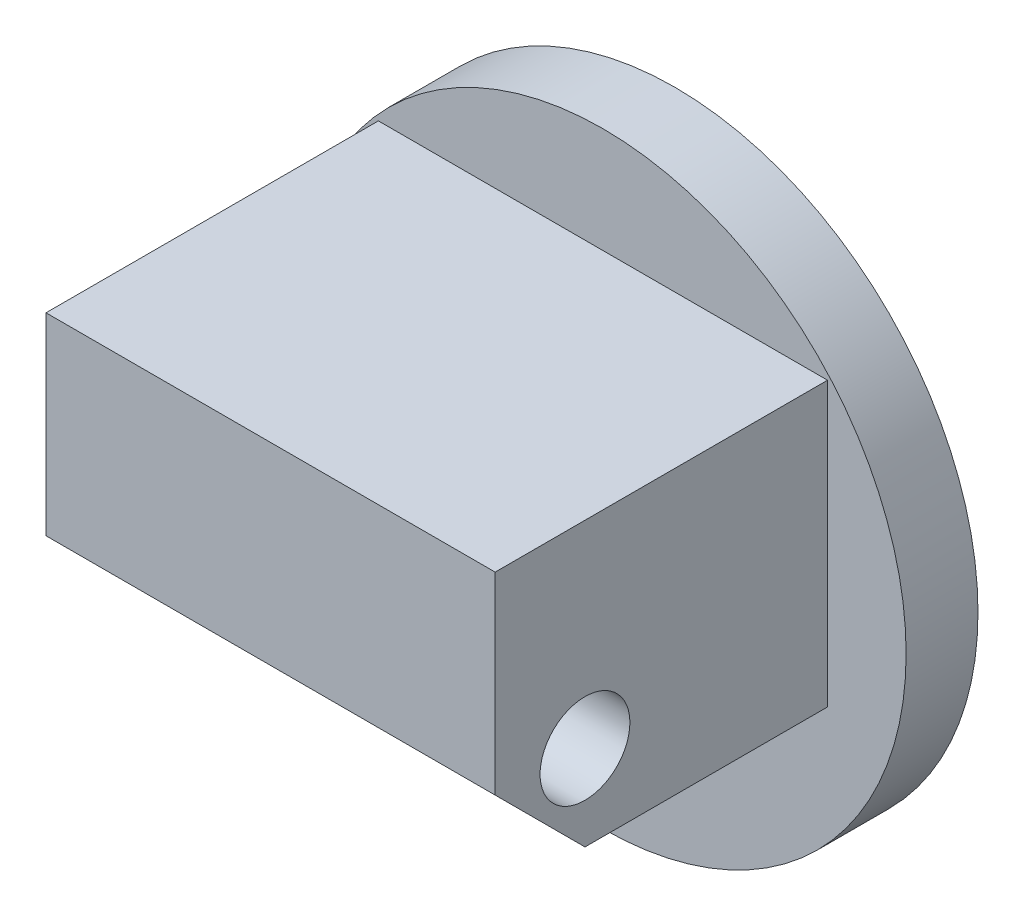
ISO-10303-21;
HEADER;
FILE_DESCRIPTION(('STEP AP214'),'2;1');
FILE_NAME('part.step','',(''),(''),'','','');
FILE_SCHEMA(('AUTOMOTIVE_DESIGN { 1 0 10303 214 1 1 1 1 }'));
ENDSEC;
DATA;
#1=APPLICATION_CONTEXT('core data for automotive mechanical design processes');
#2=APPLICATION_PROTOCOL_DEFINITION('international standard','automotive_design',2000,#1);
#3=PRODUCT_CONTEXT('',#1,'mechanical');
#4=PRODUCT('Part','Part','',(#3));
#5=PRODUCT_RELATED_PRODUCT_CATEGORY('part','',(#4));
#6=PRODUCT_DEFINITION_FORMATION('','',#4);
#7=PRODUCT_DEFINITION_CONTEXT('part definition',#1,'design');
#8=PRODUCT_DEFINITION('design','',#6,#7);
#9=PRODUCT_DEFINITION_SHAPE('','',#8);
#10=(LENGTH_UNIT() NAMED_UNIT(*) SI_UNIT(.MILLI.,.METRE.));
#11=(NAMED_UNIT(*) PLANE_ANGLE_UNIT() SI_UNIT($,.RADIAN.));
#12=(NAMED_UNIT(*) SI_UNIT($,.STERADIAN.) SOLID_ANGLE_UNIT());
#13=UNCERTAINTY_MEASURE_WITH_UNIT(LENGTH_MEASURE(1.E-05),#10,'distance_accuracy_value','');
#14=(GEOMETRIC_REPRESENTATION_CONTEXT(3) GLOBAL_UNCERTAINTY_ASSIGNED_CONTEXT((#13)) GLOBAL_UNIT_ASSIGNED_CONTEXT((#10,
#11,#12)) REPRESENTATION_CONTEXT('',''));
#15=CARTESIAN_POINT('',(0.,0.,0.));
#16=DIRECTION('',(0.,0.,1.));
#17=DIRECTION('',(1.,0.,0.));
#18=AXIS2_PLACEMENT_3D('',#15,#16,#17);
#19=CARTESIAN_POINT('',(0.,0.,9.));
#20=DIRECTION('',(0.,0.,-1.));
#21=DIRECTION('',(-1.,0.,0.));
#22=AXIS2_PLACEMENT_3D('',#19,#20,#21);
#23=CYLINDRICAL_SURFACE('',#22,6.75000000000001);
#24=CARTESIAN_POINT('',(0.,0.,0.));
#25=DIRECTION('',(0.,0.,1.));
#26=DIRECTION('',(1.,0.,0.));
#27=AXIS2_PLACEMENT_3D('',#24,#25,#26);
#28=CIRCLE('',#27,6.75000000000001);
#29=CARTESIAN_POINT('',(6.75000000000001,0.,0.));
#30=VERTEX_POINT('',#29);
#31=EDGE_CURVE('E127',#30,#30,#28,.T.);
#32=ORIENTED_EDGE('',*,*,#31,.T.);
#33=EDGE_LOOP('',(#32));
#34=FACE_BOUND('',#33,.T.);
#35=CARTESIAN_POINT('',(0.,0.,1.6));
#36=DIRECTION('',(0.,0.,-1.));
#37=DIRECTION('',(-1.,0.,0.));
#38=AXIS2_PLACEMENT_3D('',#35,#36,#37);
#39=CIRCLE('',#38,6.75000000000001);
#40=CARTESIAN_POINT('',(-6.75000000000001,0.,1.6));
#41=VERTEX_POINT('',#40);
#42=EDGE_CURVE('E117',#41,#41,#39,.T.);
#43=ORIENTED_EDGE('',*,*,#42,.T.);
#44=EDGE_LOOP('',(#43));
#45=FACE_BOUND('',#44,.T.);
#46=ADVANCED_FACE('F49',(#34,#45),#23,.T.);
#47=CARTESIAN_POINT('',(0.,0.,9.));
#48=DIRECTION('',(0.,0.,1.));
#49=DIRECTION('',(1.,0.,0.));
#50=AXIS2_PLACEMENT_3D('',#47,#48,#49);
#51=PLANE('',#50);
#52=DIRECTION('',(0.,1.,0.));
#53=VECTOR('',#52,1.);
#54=CARTESIAN_POINT('',(-5.,0.,9.));
#55=LINE('',#54,#53);
#56=CARTESIAN_POINT('',(-5.,0.0999999999999987,9.));
#57=VERTEX_POINT('',#56);
#58=CARTESIAN_POINT('',(-5.,4.39999999999999,9.));
#59=VERTEX_POINT('',#58);
#60=EDGE_CURVE('E115',#57,#59,#55,.T.);
#61=ORIENTED_EDGE('',*,*,#60,.F.);
#62=DIRECTION('',(1.,0.,0.));
#63=VECTOR('',#62,1.);
#64=CARTESIAN_POINT('',(0.,0.0999999999999987,9.));
#65=LINE('',#64,#63);
#66=CARTESIAN_POINT('',(5.,0.0999999999999987,9.));
#67=VERTEX_POINT('',#66);
#68=EDGE_CURVE('E145',#57,#67,#65,.T.);
#69=ORIENTED_EDGE('',*,*,#68,.T.);
#70=DIRECTION('',(0.,-1.,0.));
#71=VECTOR('',#70,1.);
#72=CARTESIAN_POINT('',(5.,0.,9.));
#73=LINE('',#72,#71);
#74=CARTESIAN_POINT('',(5.,4.39999999999999,9.));
#75=VERTEX_POINT('',#74);
#76=EDGE_CURVE('E137',#75,#67,#73,.T.);
#77=ORIENTED_EDGE('',*,*,#76,.F.);
#78=DIRECTION('',(1.,0.,0.));
#79=VECTOR('',#78,1.);
#80=CARTESIAN_POINT('',(-6.75000000000001,4.39999999999999,9.));
#81=LINE('',#80,#79);
#82=EDGE_CURVE('E107',#59,#75,#81,.T.);
#83=ORIENTED_EDGE('',*,*,#82,.F.);
#84=EDGE_LOOP('',(#61,#69,#77,#83));
#85=FACE_BOUND('',#84,.T.);
#86=ADVANCED_FACE('F154',(#85),#51,.T.);
#87=CARTESIAN_POINT('',(5.,-6.75000000000001,1.6));
#88=DIRECTION('',(-1.,0.,0.));
#89=DIRECTION('',(0.,0.,1.));
#90=AXIS2_PLACEMENT_3D('',#87,#88,#89);
#91=PLANE('',#90);
#92=CARTESIAN_POINT('',(5.,0.,7.));
#93=DIRECTION('',(1.,0.,0.));
#94=DIRECTION('',(0.,0.,-1.));
#95=AXIS2_PLACEMENT_3D('',#92,#93,#94);
#96=CIRCLE('',#95,1.);
#97=CARTESIAN_POINT('',(5.,0.,6.));
#98=VERTEX_POINT('',#97);
#99=EDGE_CURVE('E148',#98,#98,#96,.T.);
#100=ORIENTED_EDGE('',*,*,#99,.F.);
#101=EDGE_LOOP('',(#100));
#102=FACE_BOUND('',#101,.T.);
#103=ORIENTED_EDGE('',*,*,#76,.T.);
#104=DIRECTION('',(0.,0.707106781186548,0.707106781186547));
#105=VECTOR('',#104,1.);
#106=CARTESIAN_POINT('',(5.,0.099999999999999,9.));
#107=LINE('',#106,#105);
#108=CARTESIAN_POINT('',(5.,-1.90000000000001,6.99999999999999));
#109=VERTEX_POINT('',#108);
#110=EDGE_CURVE('E72',#67,#109,#107,.F.);
#111=ORIENTED_EDGE('',*,*,#110,.T.);
#112=DIRECTION('',(0.,0.,1.));
#113=VECTOR('',#112,1.);
#114=CARTESIAN_POINT('',(5.,-1.90000000000001,1.6));
#115=LINE('',#114,#113);
#116=CARTESIAN_POINT('',(5.,-1.90000000000001,1.6));
#117=VERTEX_POINT('',#116);
#118=EDGE_CURVE('E129',#117,#109,#115,.T.);
#119=ORIENTED_EDGE('',*,*,#118,.F.);
#120=DIRECTION('',(0.,1.,0.));
#121=VECTOR('',#120,1.);
#122=CARTESIAN_POINT('',(5.,-6.75000000000001,1.6));
#123=LINE('',#122,#121);
#124=CARTESIAN_POINT('',(5.,4.39999999999999,1.6));
#125=VERTEX_POINT('',#124);
#126=EDGE_CURVE('E124',#117,#125,#123,.T.);
#127=ORIENTED_EDGE('',*,*,#126,.T.);
#128=DIRECTION('',(0.,0.,1.));
#129=VECTOR('',#128,1.);
#130=CARTESIAN_POINT('',(5.,4.39999999999999,1.6));
#131=LINE('',#130,#129);
#132=EDGE_CURVE('E102',#125,#75,#131,.T.);
#133=ORIENTED_EDGE('',*,*,#132,.T.);
#134=EDGE_LOOP('',(#103,#111,#119,#127,#133));
#135=FACE_BOUND('',#134,.T.);
#136=ADVANCED_FACE('F157',(#102,#135),#91,.F.);
#137=CARTESIAN_POINT('',(-5.,-6.75000000000001,1.6));
#138=DIRECTION('',(1.,0.,0.));
#139=DIRECTION('',(0.,0.,-1.));
#140=AXIS2_PLACEMENT_3D('',#137,#138,#139);
#141=PLANE('',#140);
#142=CARTESIAN_POINT('',(-5.,0.,7.));
#143=DIRECTION('',(1.,0.,0.));
#144=DIRECTION('',(0.,0.,-1.));
#145=AXIS2_PLACEMENT_3D('',#142,#143,#144);
#146=CIRCLE('',#145,1.);
#147=CARTESIAN_POINT('',(-5.,0.,6.));
#148=VERTEX_POINT('',#147);
#149=EDGE_CURVE('E108',#148,#148,#146,.T.);
#150=ORIENTED_EDGE('',*,*,#149,.T.);
#151=EDGE_LOOP('',(#150));
#152=FACE_BOUND('',#151,.T.);
#153=DIRECTION('',(0.,0.,-1.));
#154=VECTOR('',#153,1.);
#155=CARTESIAN_POINT('',(-5.,-1.90000000000001,1.6));
#156=LINE('',#155,#154);
#157=CARTESIAN_POINT('',(-5.,-1.90000000000001,6.99999999999999));
#158=VERTEX_POINT('',#157);
#159=CARTESIAN_POINT('',(-5.,-1.90000000000001,1.6));
#160=VERTEX_POINT('',#159);
#161=EDGE_CURVE('E116',#158,#160,#156,.T.);
#162=ORIENTED_EDGE('',*,*,#161,.F.);
#163=DIRECTION('',(0.,-0.707106781186548,-0.707106781186547));
#164=VECTOR('',#163,1.);
#165=CARTESIAN_POINT('',(-5.,0.099999999999999,9.));
#166=LINE('',#165,#164);
#167=EDGE_CURVE('E11',#158,#57,#166,.F.);
#168=ORIENTED_EDGE('',*,*,#167,.T.);
#169=ORIENTED_EDGE('',*,*,#60,.T.);
#170=DIRECTION('',(0.,0.,-1.));
#171=VECTOR('',#170,1.);
#172=CARTESIAN_POINT('',(-5.,4.39999999999999,1.6));
#173=LINE('',#172,#171);
#174=CARTESIAN_POINT('',(-5.,4.39999999999999,1.6));
#175=VERTEX_POINT('',#174);
#176=EDGE_CURVE('E99',#59,#175,#173,.T.);
#177=ORIENTED_EDGE('',*,*,#176,.T.);
#178=DIRECTION('',(0.,1.,0.));
#179=VECTOR('',#178,1.);
#180=CARTESIAN_POINT('',(-5.,-6.75000000000001,1.6));
#181=LINE('',#180,#179);
#182=EDGE_CURVE('E113',#160,#175,#181,.T.);
#183=ORIENTED_EDGE('',*,*,#182,.F.);
#184=EDGE_LOOP('',(#162,#168,#169,#177,#183));
#185=FACE_BOUND('',#184,.T.);
#186=ADVANCED_FACE('F112',(#152,#185),#141,.F.);
#187=CARTESIAN_POINT('',(0.,0.,0.));
#188=DIRECTION('',(0.,0.,1.));
#189=DIRECTION('',(1.,0.,0.));
#190=AXIS2_PLACEMENT_3D('',#187,#188,#189);
#191=PLANE('',#190);
#192=CARTESIAN_POINT('',(0.,0.,0.));
#193=DIRECTION('',(0.,0.,-1.));
#194=DIRECTION('',(-1.,0.,0.));
#195=AXIS2_PLACEMENT_3D('',#192,#193,#194);
#196=CIRCLE('',#195,5.);
#197=CARTESIAN_POINT('',(-5.,0.,0.));
#198=VERTEX_POINT('',#197);
#199=EDGE_CURVE('E134',#198,#198,#196,.T.);
#200=ORIENTED_EDGE('',*,*,#199,.F.);
#201=EDGE_LOOP('',(#200));
#202=FACE_BOUND('',#201,.T.);
#203=ORIENTED_EDGE('',*,*,#31,.F.);
#204=EDGE_LOOP('',(#203));
#205=FACE_BOUND('',#204,.T.);
#206=ADVANCED_FACE('F173',(#202,#205),#191,.F.);
#207=CARTESIAN_POINT('',(0.,0.,-1.));
#208=DIRECTION('',(0.,0.,1.));
#209=DIRECTION('',(1.,0.,0.));
#210=AXIS2_PLACEMENT_3D('',#207,#208,#209);
#211=CYLINDRICAL_SURFACE('',#210,5.);
#212=CARTESIAN_POINT('',(0.,0.,-1.));
#213=DIRECTION('',(0.,0.,-1.));
#214=DIRECTION('',(-1.,0.,0.));
#215=AXIS2_PLACEMENT_3D('',#212,#213,#214);
#216=CIRCLE('',#215,5.);
#217=CARTESIAN_POINT('',(-5.,0.,-1.));
#218=VERTEX_POINT('',#217);
#219=EDGE_CURVE('E123',#218,#218,#216,.T.);
#220=ORIENTED_EDGE('',*,*,#219,.F.);
#221=EDGE_LOOP('',(#220));
#222=FACE_BOUND('',#221,.T.);
#223=ORIENTED_EDGE('',*,*,#199,.T.);
#224=EDGE_LOOP('',(#223));
#225=FACE_BOUND('',#224,.T.);
#226=ADVANCED_FACE('F187',(#222,#225),#211,.T.);
#227=CARTESIAN_POINT('',(0.,0.,-1.));
#228=DIRECTION('',(0.,0.,-1.));
#229=DIRECTION('',(-1.,0.,0.));
#230=AXIS2_PLACEMENT_3D('',#227,#228,#229);
#231=PLANE('',#230);
#232=ORIENTED_EDGE('',*,*,#219,.T.);
#233=EDGE_LOOP('',(#232));
#234=FACE_BOUND('',#233,.T.);
#235=ADVANCED_FACE('F191',(#234),#231,.T.);
#236=CARTESIAN_POINT('',(-6.75000000000001,-6.75000000000001,1.6));
#237=DIRECTION('',(0.,0.,-1.));
#238=DIRECTION('',(-1.,0.,0.));
#239=AXIS2_PLACEMENT_3D('',#236,#237,#238);
#240=PLANE('',#239);
#241=ORIENTED_EDGE('',*,*,#126,.F.);
#242=DIRECTION('',(1.,0.,0.));
#243=VECTOR('',#242,1.);
#244=CARTESIAN_POINT('',(-6.75000000000001,-1.90000000000001,1.6));
#245=LINE('',#244,#243);
#246=EDGE_CURVE('E122',#160,#117,#245,.T.);
#247=ORIENTED_EDGE('',*,*,#246,.F.);
#248=ORIENTED_EDGE('',*,*,#182,.T.);
#249=DIRECTION('',(1.,0.,0.));
#250=VECTOR('',#249,1.);
#251=CARTESIAN_POINT('',(-6.75000000000001,4.39999999999999,1.6));
#252=LINE('',#251,#250);
#253=EDGE_CURVE('E96',#175,#125,#252,.T.);
#254=ORIENTED_EDGE('',*,*,#253,.T.);
#255=EDGE_LOOP('',(#241,#247,#248,#254));
#256=FACE_BOUND('',#255,.T.);
#257=ORIENTED_EDGE('',*,*,#42,.F.);
#258=EDGE_LOOP('',(#257));
#259=FACE_BOUND('',#258,.T.);
#260=ADVANCED_FACE('F120',(#256,#259),#240,.F.);
#261=CARTESIAN_POINT('',(-6.75000000000001,4.39999999999999,0.));
#262=DIRECTION('',(0.,-1.,0.));
#263=DIRECTION('',(0.,0.,-1.));
#264=AXIS2_PLACEMENT_3D('',#261,#262,#263);
#265=PLANE('',#264);
#266=ORIENTED_EDGE('',*,*,#253,.F.);
#267=ORIENTED_EDGE('',*,*,#176,.F.);
#268=ORIENTED_EDGE('',*,*,#82,.T.);
#269=ORIENTED_EDGE('',*,*,#132,.F.);
#270=EDGE_LOOP('',(#266,#267,#268,#269));
#271=FACE_BOUND('',#270,.T.);
#272=ADVANCED_FACE('F98',(#271),#265,.F.);
#273=CARTESIAN_POINT('',(-6.75000000000001,-1.90000000000001,0.));
#274=DIRECTION('',(0.,-1.,0.));
#275=DIRECTION('',(0.,0.,-1.));
#276=AXIS2_PLACEMENT_3D('',#273,#274,#275);
#277=PLANE('',#276);
#278=ORIENTED_EDGE('',*,*,#118,.T.);
#279=DIRECTION('',(-1.,0.,0.));
#280=VECTOR('',#279,1.);
#281=CARTESIAN_POINT('',(-6.75000000000001,-1.90000000000001,6.99999999999999));
#282=LINE('',#281,#280);
#283=EDGE_CURVE('E58',#109,#158,#282,.T.);
#284=ORIENTED_EDGE('',*,*,#283,.T.);
#285=ORIENTED_EDGE('',*,*,#161,.T.);
#286=ORIENTED_EDGE('',*,*,#246,.T.);
#287=EDGE_LOOP('',(#278,#284,#285,#286));
#288=FACE_BOUND('',#287,.T.);
#289=ADVANCED_FACE('F205',(#288),#277,.T.);
#290=CARTESIAN_POINT('',(-6.75000000000001,0.,7.));
#291=DIRECTION('',(1.,0.,0.));
#292=DIRECTION('',(0.,0.,-1.));
#293=AXIS2_PLACEMENT_3D('',#290,#291,#292);
#294=CYLINDRICAL_SURFACE('',#293,1.);
#295=CARTESIAN_POINT('',(5.,0.,6.));
#296=CARTESIAN_POINT('',(4.89583333333333,0.,6.));
#297=CARTESIAN_POINT('',(4.79166666666667,0.,6.));
#298=CARTESIAN_POINT('',(4.58333333333333,0.,6.));
#299=CARTESIAN_POINT('',(4.47916666666667,0.,6.));
#300=CARTESIAN_POINT('',(4.27083333333333,0.,6.));
#301=CARTESIAN_POINT('',(4.16666666666667,0.,6.));
#302=CARTESIAN_POINT('',(3.95833333333333,0.,6.));
#303=CARTESIAN_POINT('',(3.85416666666667,0.,6.));
#304=CARTESIAN_POINT('',(3.64583333333333,0.,6.));
#305=CARTESIAN_POINT('',(3.54166666666667,0.,6.));
#306=CARTESIAN_POINT('',(3.33333333333333,0.,6.));
#307=CARTESIAN_POINT('',(3.22916666666667,0.,6.));
#308=CARTESIAN_POINT('',(3.02083333333333,0.,6.));
#309=CARTESIAN_POINT('',(2.91666666666667,0.,6.));
#310=CARTESIAN_POINT('',(2.70833333333333,0.,6.));
#311=CARTESIAN_POINT('',(2.60416666666667,0.,6.));
#312=CARTESIAN_POINT('',(2.39583333333333,0.,6.));
#313=CARTESIAN_POINT('',(2.29166666666667,0.,6.));
#314=CARTESIAN_POINT('',(2.08333333333333,0.,6.));
#315=CARTESIAN_POINT('',(1.97916666666667,0.,6.));
#316=CARTESIAN_POINT('',(1.77083333333333,0.,6.));
#317=CARTESIAN_POINT('',(1.66666666666667,0.,6.));
#318=CARTESIAN_POINT('',(1.45833333333333,0.,6.));
#319=CARTESIAN_POINT('',(1.35416666666667,0.,6.));
#320=CARTESIAN_POINT('',(1.14583333333333,0.,6.));
#321=CARTESIAN_POINT('',(1.04166666666667,0.,6.));
#322=CARTESIAN_POINT('',(0.833333333333333,0.,6.));
#323=CARTESIAN_POINT('',(0.729166666666666,0.,6.));
#324=CARTESIAN_POINT('',(0.520833333333333,0.,6.));
#325=CARTESIAN_POINT('',(0.416666666666667,0.,6.));
#326=CARTESIAN_POINT('',(0.208333333333333,0.,6.));
#327=CARTESIAN_POINT('',(0.104166666666667,0.,6.));
#328=CARTESIAN_POINT('',(-0.104166666666667,0.,6.));
#329=CARTESIAN_POINT('',(-0.208333333333333,0.,6.));
#330=CARTESIAN_POINT('',(-0.416666666666667,0.,6.));
#331=CARTESIAN_POINT('',(-0.520833333333333,0.,6.));
#332=CARTESIAN_POINT('',(-0.729166666666667,0.,6.));
#333=CARTESIAN_POINT('',(-0.833333333333333,0.,6.));
#334=CARTESIAN_POINT('',(-1.04166666666667,0.,6.));
#335=CARTESIAN_POINT('',(-1.14583333333333,0.,6.));
#336=CARTESIAN_POINT('',(-1.35416666666667,0.,6.));
#337=CARTESIAN_POINT('',(-1.45833333333333,0.,6.));
#338=CARTESIAN_POINT('',(-1.66666666666667,0.,6.));
#339=CARTESIAN_POINT('',(-1.77083333333333,0.,6.));
#340=CARTESIAN_POINT('',(-1.97916666666667,0.,6.));
#341=CARTESIAN_POINT('',(-2.08333333333333,0.,6.));
#342=CARTESIAN_POINT('',(-2.29166666666667,0.,6.));
#343=CARTESIAN_POINT('',(-2.39583333333333,0.,6.));
#344=CARTESIAN_POINT('',(-2.60416666666667,0.,6.));
#345=CARTESIAN_POINT('',(-2.70833333333333,0.,6.));
#346=CARTESIAN_POINT('',(-2.91666666666667,0.,6.));
#347=CARTESIAN_POINT('',(-3.02083333333333,0.,6.));
#348=CARTESIAN_POINT('',(-3.22916666666667,0.,6.));
#349=CARTESIAN_POINT('',(-3.33333333333333,0.,6.));
#350=CARTESIAN_POINT('',(-3.54166666666667,0.,6.));
#351=CARTESIAN_POINT('',(-3.64583333333333,0.,6.));
#352=CARTESIAN_POINT('',(-3.85416666666667,0.,6.));
#353=CARTESIAN_POINT('',(-3.95833333333333,0.,6.));
#354=CARTESIAN_POINT('',(-4.16666666666667,0.,6.));
#355=CARTESIAN_POINT('',(-4.27083333333333,0.,6.));
#356=CARTESIAN_POINT('',(-4.47916666666667,0.,6.));
#357=CARTESIAN_POINT('',(-4.58333333333333,0.,6.));
#358=CARTESIAN_POINT('',(-4.79166666666667,0.,6.));
#359=CARTESIAN_POINT('',(-4.89583333333333,0.,6.));
#360=CARTESIAN_POINT('',(-5.,0.,6.));
#361=B_SPLINE_CURVE_WITH_KNOTS('',3,(#295,#296,#297,#298,#299,#300,#301,#302,#303,#304,#305,
#306,#307,#308,#309,#310,#311,#312,#313,#314,#315,#316,#317,#318,#319,#320,#321,#322,#323,#324,
#325,#326,#327,#328,#329,#330,#331,#332,#333,#334,#335,#336,#337,#338,#339,#340,#341,#342,#343,
#344,#345,#346,#347,#348,#349,#350,#351,#352,#353,#354,#355,#356,#357,#358,#359,#360),
.UNSPECIFIED.,.F.,.F.,(4,2,2,2,2,2,2,2,2,2,2,2,2,2,2,2,2,2,2,2,2,2,2,2,2,2,2,2,2,2,2,2,4),(0.,
0.3125,0.625000000000001,0.937500000000001,1.25,1.5625,1.875,2.1875,2.5,2.8125,3.125,3.4375,
3.75,4.0625,4.375,4.6875,5.,5.3125,5.625,5.9375,6.25,6.5625,6.875,7.1875,7.5,7.8125,8.125,
8.4375,8.75,9.0625,9.375,9.6875,10.),.UNSPECIFIED.);
#362=EDGE_CURVE('BSEAM164',#98,#148,#361,.T.);
#363=ORIENTED_EDGE('',*,*,#99,.T.);
#364=ORIENTED_EDGE('',*,*,#149,.F.);
#365=ORIENTED_EDGE('',*,*,#362,.T.);
#366=ORIENTED_EDGE('',*,*,#362,.F.);
#367=EDGE_LOOP('',(#363,#365,#364,#366));
#368=FACE_BOUND('',#367,.T.);
#369=ADVANCED_FACE('F164',(#368),#294,.F.);
#370=CARTESIAN_POINT('',(0.,0.0999999999999987,9.));
#371=DIRECTION('',(0.,0.707106781186547,-0.707106781186548));
#372=DIRECTION('',(1.,0.,0.));
#373=AXIS2_PLACEMENT_3D('',#370,#371,#372);
#374=PLANE('',#373);
#375=ORIENTED_EDGE('',*,*,#167,.F.);
#376=ORIENTED_EDGE('',*,*,#283,.F.);
#377=ORIENTED_EDGE('',*,*,#110,.F.);
#378=ORIENTED_EDGE('',*,*,#68,.F.);
#379=EDGE_LOOP('',(#375,#376,#377,#378));
#380=FACE_BOUND('',#379,.T.);
#381=ADVANCED_FACE('F52',(#380),#374,.F.);
#382=CLOSED_SHELL('',(#46,#86,#136,#186,#206,#226,#235,#260,#272,#289,#369,#381));
#383=MANIFOLD_SOLID_BREP('B2',#382);
#384=ADVANCED_BREP_SHAPE_REPRESENTATION('',(#18,#383),#14);
#385=SHAPE_DEFINITION_REPRESENTATION(#9,#384);
ENDSEC;
END-ISO-10303-21;
